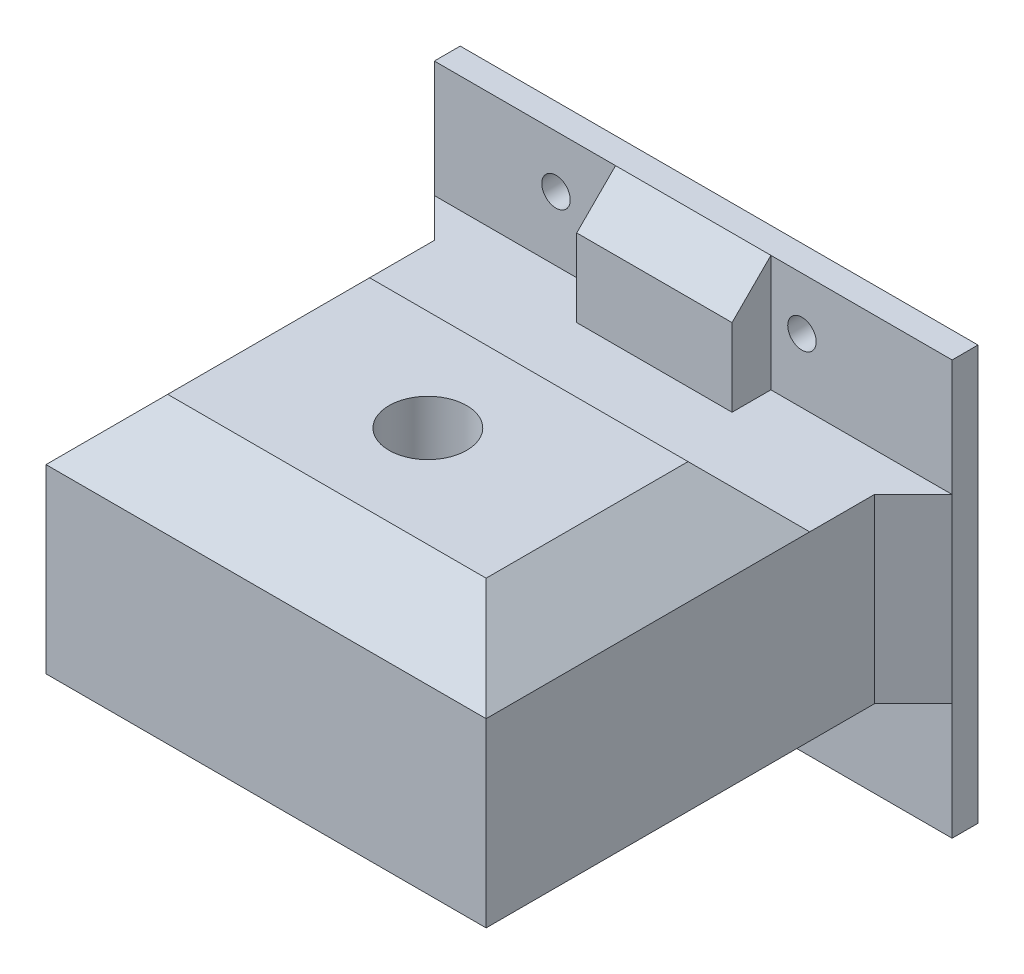
ISO-10303-21;
HEADER;
FILE_DESCRIPTION(('STEP AP214'),'2;1');
FILE_NAME('part.step','',(''),(''),'','','');
FILE_SCHEMA(('AUTOMOTIVE_DESIGN { 1 0 10303 214 1 1 1 1 }'));
ENDSEC;
DATA;
#1=APPLICATION_CONTEXT('core data for automotive mechanical design processes');
#2=APPLICATION_PROTOCOL_DEFINITION('international standard','automotive_design',2000,#1);
#3=PRODUCT_CONTEXT('',#1,'mechanical');
#4=PRODUCT('Part','Part','',(#3));
#5=PRODUCT_RELATED_PRODUCT_CATEGORY('part','',(#4));
#6=PRODUCT_DEFINITION_FORMATION('','',#4);
#7=PRODUCT_DEFINITION_CONTEXT('part definition',#1,'design');
#8=PRODUCT_DEFINITION('design','',#6,#7);
#9=PRODUCT_DEFINITION_SHAPE('','',#8);
#10=(LENGTH_UNIT() NAMED_UNIT(*) SI_UNIT(.MILLI.,.METRE.));
#11=(NAMED_UNIT(*) PLANE_ANGLE_UNIT() SI_UNIT($,.RADIAN.));
#12=(NAMED_UNIT(*) SI_UNIT($,.STERADIAN.) SOLID_ANGLE_UNIT());
#13=UNCERTAINTY_MEASURE_WITH_UNIT(LENGTH_MEASURE(1.E-05),#10,'distance_accuracy_value','');
#14=(GEOMETRIC_REPRESENTATION_CONTEXT(3) GLOBAL_UNCERTAINTY_ASSIGNED_CONTEXT((#13)) GLOBAL_UNIT_ASSIGNED_CONTEXT((#10,
#11,#12)) REPRESENTATION_CONTEXT('',''));
#15=CARTESIAN_POINT('',(0.,0.,0.));
#16=DIRECTION('',(0.,0.,1.));
#17=DIRECTION('',(1.,0.,0.));
#18=AXIS2_PLACEMENT_3D('',#15,#16,#17);
#19=CARTESIAN_POINT('',(612.,302.72,15.));
#20=DIRECTION('',(0.,-1.,0.));
#21=DIRECTION('',(0.,0.,-1.));
#22=AXIS2_PLACEMENT_3D('',#19,#20,#21);
#23=PLANE('',#22);
#24=DIRECTION('',(-1.,0.,0.));
#25=VECTOR('',#24,1.);
#26=CARTESIAN_POINT('',(497.,302.72,40.));
#27=LINE('',#26,#25);
#28=CARTESIAN_POINT('',(667.,302.72,40.));
#29=VERTEX_POINT('',#28);
#30=CARTESIAN_POINT('',(497.,302.72,40.));
#31=VERTEX_POINT('',#30);
#32=EDGE_CURVE('E249',#29,#31,#27,.T.);
#33=ORIENTED_EDGE('',*,*,#32,.F.);
#34=DIRECTION('',(0.,0.,-1.));
#35=VECTOR('',#34,1.);
#36=CARTESIAN_POINT('',(667.,302.72,165.));
#37=LINE('',#36,#35);
#38=CARTESIAN_POINT('',(667.,302.72,15.));
#39=VERTEX_POINT('',#38);
#40=EDGE_CURVE('E416',#29,#39,#37,.T.);
#41=ORIENTED_EDGE('',*,*,#40,.T.);
#42=DIRECTION('',(0.70710678118655,0.,-0.707106781186545));
#43=VECTOR('',#42,1.);
#44=CARTESIAN_POINT('',(667.,302.72,15.));
#45=LINE('',#44,#43);
#46=CARTESIAN_POINT('',(682.,302.72,0.));
#47=VERTEX_POINT('',#46);
#48=EDGE_CURVE('E297',#39,#47,#45,.T.);
#49=ORIENTED_EDGE('',*,*,#48,.T.);
#50=DIRECTION('',(-1.,0.,0.));
#51=VECTOR('',#50,1.);
#52=CARTESIAN_POINT('',(612.,302.72,0.));
#53=LINE('',#52,#51);
#54=CARTESIAN_POINT('',(612.,302.72,0.));
#55=VERTEX_POINT('',#54);
#56=EDGE_CURVE('E393',#47,#55,#53,.T.);
#57=ORIENTED_EDGE('',*,*,#56,.T.);
#58=DIRECTION('',(0.,0.,-1.));
#59=VECTOR('',#58,1.);
#60=CARTESIAN_POINT('',(612.,302.72,15.));
#61=LINE('',#60,#59);
#62=CARTESIAN_POINT('',(612.,302.72,15.));
#63=VERTEX_POINT('',#62);
#64=EDGE_CURVE('E376',#63,#55,#61,.T.);
#65=ORIENTED_EDGE('',*,*,#64,.F.);
#66=DIRECTION('',(-1.,0.,0.));
#67=VECTOR('',#66,1.);
#68=CARTESIAN_POINT('',(497.,302.72,15.));
#69=LINE('',#68,#67);
#70=CARTESIAN_POINT('',(552.,302.72,15.));
#71=VERTEX_POINT('',#70);
#72=EDGE_CURVE('E272',#63,#71,#69,.T.);
#73=ORIENTED_EDGE('',*,*,#72,.T.);
#74=DIRECTION('',(0.,0.,-1.));
#75=VECTOR('',#74,1.);
#76=CARTESIAN_POINT('',(552.,302.72,15.));
#77=LINE('',#76,#75);
#78=CARTESIAN_POINT('',(552.,302.72,0.));
#79=VERTEX_POINT('',#78);
#80=EDGE_CURVE('E379',#71,#79,#77,.T.);
#81=ORIENTED_EDGE('',*,*,#80,.T.);
#82=DIRECTION('',(-1.,0.,0.));
#83=VECTOR('',#82,1.);
#84=CARTESIAN_POINT('',(482.,302.72,0.));
#85=LINE('',#84,#83);
#86=CARTESIAN_POINT('',(482.,302.72,0.));
#87=VERTEX_POINT('',#86);
#88=EDGE_CURVE('E383',#79,#87,#85,.T.);
#89=ORIENTED_EDGE('',*,*,#88,.T.);
#90=DIRECTION('',(0.707106781186547,0.,0.707106781186548));
#91=VECTOR('',#90,1.);
#92=CARTESIAN_POINT('',(497.,302.72,15.));
#93=LINE('',#92,#91);
#94=CARTESIAN_POINT('',(497.,302.72,15.));
#95=VERTEX_POINT('',#94);
#96=EDGE_CURVE('E273',#87,#95,#93,.T.);
#97=ORIENTED_EDGE('',*,*,#96,.T.);
#98=DIRECTION('',(0.,0.,-1.));
#99=VECTOR('',#98,1.);
#100=CARTESIAN_POINT('',(497.,302.72,165.));
#101=LINE('',#100,#99);
#102=EDGE_CURVE('E418',#31,#95,#101,.T.);
#103=ORIENTED_EDGE('',*,*,#102,.F.);
#104=EDGE_LOOP('',(#33,#41,#49,#57,#65,#73,#81,#89,#97,#103));
#105=FACE_BOUND('',#104,.T.);
#106=ADVANCED_FACE('F38',(#105),#23,.F.);
#107=CARTESIAN_POINT('',(0.,0.,15.));
#108=DIRECTION('',(0.,0.,1.));
#109=DIRECTION('',(1.,0.,0.));
#110=AXIS2_PLACEMENT_3D('',#107,#108,#109);
#111=PLANE('',#110);
#112=ORIENTED_EDGE('',*,*,#72,.F.);
#113=DIRECTION('',(0.,1.,0.));
#114=VECTOR('',#113,1.);
#115=CARTESIAN_POINT('',(612.,347.72,15.));
#116=LINE('',#115,#114);
#117=CARTESIAN_POINT('',(612.,332.72,15.));
#118=VERTEX_POINT('',#117);
#119=EDGE_CURVE('E408',#63,#118,#116,.T.);
#120=ORIENTED_EDGE('',*,*,#119,.T.);
#121=DIRECTION('',(-1.,0.,0.));
#122=VECTOR('',#121,1.);
#123=CARTESIAN_POINT('',(552.,332.72,15.));
#124=LINE('',#123,#122);
#125=CARTESIAN_POINT('',(552.,332.72,15.));
#126=VERTEX_POINT('',#125);
#127=EDGE_CURVE('E302',#118,#126,#124,.T.);
#128=ORIENTED_EDGE('',*,*,#127,.T.);
#129=DIRECTION('',(0.,-1.,0.));
#130=VECTOR('',#129,1.);
#131=CARTESIAN_POINT('',(552.,347.72,15.));
#132=LINE('',#131,#130);
#133=EDGE_CURVE('E382',#126,#71,#132,.T.);
#134=ORIENTED_EDGE('',*,*,#133,.T.);
#135=EDGE_LOOP('',(#112,#120,#128,#134));
#136=FACE_BOUND('',#135,.T.);
#137=ADVANCED_FACE('F526',(#136),#111,.T.);
#138=CARTESIAN_POINT('',(0.,0.,0.));
#139=DIRECTION('',(0.,0.,-1.));
#140=DIRECTION('',(-1.,0.,0.));
#141=AXIS2_PLACEMENT_3D('',#138,#139,#140);
#142=PLANE('',#141);
#143=CARTESIAN_POINT('',(529.,327.5,0.));
#144=DIRECTION('',(0.,0.,-1.));
#145=DIRECTION('',(-1.,0.,0.));
#146=AXIS2_PLACEMENT_3D('',#143,#144,#145);
#147=CIRCLE('',#146,5.49999999999996);
#148=CARTESIAN_POINT('',(523.5,327.5,0.));
#149=VERTEX_POINT('',#148);
#150=EDGE_CURVE('E346',#149,#149,#147,.T.);
#151=ORIENTED_EDGE('',*,*,#150,.T.);
#152=EDGE_LOOP('',(#151));
#153=FACE_BOUND('',#152,.T.);
#154=ORIENTED_EDGE('',*,*,#88,.F.);
#155=DIRECTION('',(0.,-1.,0.));
#156=VECTOR('',#155,1.);
#157=CARTESIAN_POINT('',(552.,347.72,0.));
#158=LINE('',#157,#156);
#159=CARTESIAN_POINT('',(552.,347.72,0.));
#160=VERTEX_POINT('',#159);
#161=EDGE_CURVE('E387',#160,#79,#158,.T.);
#162=ORIENTED_EDGE('',*,*,#161,.F.);
#163=DIRECTION('',(1.,0.,0.));
#164=VECTOR('',#163,1.);
#165=CARTESIAN_POINT('',(482.,347.72,0.));
#166=LINE('',#165,#164);
#167=CARTESIAN_POINT('',(482.,347.72,0.));
#168=VERTEX_POINT('',#167);
#169=EDGE_CURVE('E335',#168,#160,#166,.T.);
#170=ORIENTED_EDGE('',*,*,#169,.F.);
#171=DIRECTION('',(0.,1.,0.));
#172=VECTOR('',#171,1.);
#173=CARTESIAN_POINT('',(482.,187.72,0.));
#174=LINE('',#173,#172);
#175=EDGE_CURVE('E326',#87,#168,#174,.T.);
#176=ORIENTED_EDGE('',*,*,#175,.F.);
#177=EDGE_LOOP('',(#154,#162,#170,#176));
#178=FACE_BOUND('',#177,.T.);
#179=ADVANCED_FACE('F531',(#153,#178),#142,.F.);
#180=CARTESIAN_POINT('',(624.,327.5,0.));
#181=DIRECTION('',(0.,0.,-1.));
#182=DIRECTION('',(-1.,0.,0.));
#183=AXIS2_PLACEMENT_3D('',#180,#181,#182);
#184=CIRCLE('',#183,5.49999999999996);
#185=CARTESIAN_POINT('',(618.5,327.5,0.));
#186=VERTEX_POINT('',#185);
#187=EDGE_CURVE('E365',#186,#186,#184,.T.);
#188=ORIENTED_EDGE('',*,*,#187,.T.);
#189=EDGE_LOOP('',(#188));
#190=FACE_BOUND('',#189,.T.);
#191=DIRECTION('',(0.,1.,0.));
#192=VECTOR('',#191,1.);
#193=CARTESIAN_POINT('',(612.,347.72,0.));
#194=LINE('',#193,#192);
#195=CARTESIAN_POINT('',(612.,347.72,0.));
#196=VERTEX_POINT('',#195);
#197=EDGE_CURVE('E390',#55,#196,#194,.T.);
#198=ORIENTED_EDGE('',*,*,#197,.F.);
#199=ORIENTED_EDGE('',*,*,#56,.F.);
#200=DIRECTION('',(0.,-1.,0.));
#201=VECTOR('',#200,1.);
#202=CARTESIAN_POINT('',(682.,347.72,0.));
#203=LINE('',#202,#201);
#204=CARTESIAN_POINT('',(682.,347.72,0.));
#205=VERTEX_POINT('',#204);
#206=EDGE_CURVE('E331',#205,#47,#203,.T.);
#207=ORIENTED_EDGE('',*,*,#206,.F.);
#208=EDGE_CURVE('E338',#196,#205,#166,.T.);
#209=ORIENTED_EDGE('',*,*,#208,.F.);
#210=EDGE_LOOP('',(#198,#199,#207,#209));
#211=FACE_BOUND('',#210,.T.);
#212=ADVANCED_FACE('F567',(#190,#211),#142,.F.);
#213=CARTESIAN_POINT('',(624.,216.5,0.));
#214=DIRECTION('',(0.,0.,-1.));
#215=DIRECTION('',(-1.,0.,0.));
#216=AXIS2_PLACEMENT_3D('',#213,#214,#215);
#217=CIRCLE('',#216,5.49999999999996);
#218=CARTESIAN_POINT('',(618.5,216.5,0.));
#219=VERTEX_POINT('',#218);
#220=EDGE_CURVE('E359',#219,#219,#217,.T.);
#221=ORIENTED_EDGE('',*,*,#220,.T.);
#222=EDGE_LOOP('',(#221));
#223=FACE_BOUND('',#222,.T.);
#224=DIRECTION('',(1.,0.,0.));
#225=VECTOR('',#224,1.);
#226=CARTESIAN_POINT('',(612.,232.72,0.));
#227=LINE('',#226,#225);
#228=CARTESIAN_POINT('',(612.,232.72,0.));
#229=VERTEX_POINT('',#228);
#230=CARTESIAN_POINT('',(682.,232.72,0.));
#231=VERTEX_POINT('',#230);
#232=EDGE_CURVE('E396',#229,#231,#227,.T.);
#233=ORIENTED_EDGE('',*,*,#232,.F.);
#234=DIRECTION('',(0.,1.,0.));
#235=VECTOR('',#234,1.);
#236=CARTESIAN_POINT('',(612.,232.72,0.));
#237=LINE('',#236,#235);
#238=CARTESIAN_POINT('',(612.,187.72,0.));
#239=VERTEX_POINT('',#238);
#240=EDGE_CURVE('E399',#239,#229,#237,.T.);
#241=ORIENTED_EDGE('',*,*,#240,.F.);
#242=DIRECTION('',(-1.,0.,0.));
#243=VECTOR('',#242,1.);
#244=CARTESIAN_POINT('',(682.,187.72,0.));
#245=LINE('',#244,#243);
#246=CARTESIAN_POINT('',(682.,187.72,0.));
#247=VERTEX_POINT('',#246);
#248=EDGE_CURVE('E327',#247,#239,#245,.T.);
#249=ORIENTED_EDGE('',*,*,#248,.F.);
#250=EDGE_CURVE('E334',#231,#247,#203,.T.);
#251=ORIENTED_EDGE('',*,*,#250,.F.);
#252=EDGE_LOOP('',(#233,#241,#249,#251));
#253=FACE_BOUND('',#252,.T.);
#254=ADVANCED_FACE('F833',(#223,#253),#142,.F.);
#255=CARTESIAN_POINT('',(529.,216.5,0.));
#256=DIRECTION('',(0.,0.,-1.));
#257=DIRECTION('',(-1.,0.,0.));
#258=AXIS2_PLACEMENT_3D('',#255,#256,#257);
#259=CIRCLE('',#258,5.49999999999996);
#260=CARTESIAN_POINT('',(523.5,216.5,0.));
#261=VERTEX_POINT('',#260);
#262=EDGE_CURVE('E353',#261,#261,#259,.T.);
#263=ORIENTED_EDGE('',*,*,#262,.T.);
#264=EDGE_LOOP('',(#263));
#265=FACE_BOUND('',#264,.T.);
#266=DIRECTION('',(0.,-1.,0.));
#267=VECTOR('',#266,1.);
#268=CARTESIAN_POINT('',(552.,232.72,0.));
#269=LINE('',#268,#267);
#270=CARTESIAN_POINT('',(552.,232.72,0.));
#271=VERTEX_POINT('',#270);
#272=CARTESIAN_POINT('',(552.,187.72,0.));
#273=VERTEX_POINT('',#272);
#274=EDGE_CURVE('E402',#271,#273,#269,.T.);
#275=ORIENTED_EDGE('',*,*,#274,.F.);
#276=DIRECTION('',(1.,0.,0.));
#277=VECTOR('',#276,1.);
#278=CARTESIAN_POINT('',(482.,232.72,0.));
#279=LINE('',#278,#277);
#280=CARTESIAN_POINT('',(482.,232.72,0.));
#281=VERTEX_POINT('',#280);
#282=EDGE_CURVE('E219',#281,#271,#279,.T.);
#283=ORIENTED_EDGE('',*,*,#282,.F.);
#284=CARTESIAN_POINT('',(482.,187.72,0.));
#285=VERTEX_POINT('',#284);
#286=EDGE_CURVE('E322',#285,#281,#174,.T.);
#287=ORIENTED_EDGE('',*,*,#286,.F.);
#288=EDGE_CURVE('E330',#273,#285,#245,.T.);
#289=ORIENTED_EDGE('',*,*,#288,.F.);
#290=EDGE_LOOP('',(#275,#283,#287,#289));
#291=FACE_BOUND('',#290,.T.);
#292=ADVANCED_FACE('F473',(#265,#291),#142,.F.);
#293=CARTESIAN_POINT('',(0.,0.,-10.));
#294=DIRECTION('',(0.,0.,-1.));
#295=DIRECTION('',(-1.,0.,0.));
#296=AXIS2_PLACEMENT_3D('',#293,#294,#295);
#297=PLANE('',#296);
#298=CARTESIAN_POINT('',(624.,216.5,-10.));
#299=DIRECTION('',(0.,0.,-1.));
#300=DIRECTION('',(-1.,0.,0.));
#301=AXIS2_PLACEMENT_3D('',#298,#299,#300);
#302=CIRCLE('',#301,5.49999999999996);
#303=CARTESIAN_POINT('',(618.5,216.5,-10.));
#304=VERTEX_POINT('',#303);
#305=EDGE_CURVE('E356',#304,#304,#302,.T.);
#306=ORIENTED_EDGE('',*,*,#305,.F.);
#307=EDGE_LOOP('',(#306));
#308=FACE_BOUND('',#307,.T.);
#309=CARTESIAN_POINT('',(529.,327.5,-10.));
#310=DIRECTION('',(0.,0.,-1.));
#311=DIRECTION('',(-1.,0.,0.));
#312=AXIS2_PLACEMENT_3D('',#309,#310,#311);
#313=CIRCLE('',#312,5.49999999999996);
#314=CARTESIAN_POINT('',(523.5,327.5,-10.));
#315=VERTEX_POINT('',#314);
#316=EDGE_CURVE('E349',#315,#315,#313,.T.);
#317=ORIENTED_EDGE('',*,*,#316,.F.);
#318=EDGE_LOOP('',(#317));
#319=FACE_BOUND('',#318,.T.);
#320=DIRECTION('',(1.,0.,0.));
#321=VECTOR('',#320,1.);
#322=CARTESIAN_POINT('',(482.,347.72,-10.));
#323=LINE('',#322,#321);
#324=CARTESIAN_POINT('',(482.,347.72,-10.));
#325=VERTEX_POINT('',#324);
#326=CARTESIAN_POINT('',(682.,347.72,-10.));
#327=VERTEX_POINT('',#326);
#328=EDGE_CURVE('E325',#325,#327,#323,.T.);
#329=ORIENTED_EDGE('',*,*,#328,.T.);
#330=DIRECTION('',(0.,-1.,0.));
#331=VECTOR('',#330,1.);
#332=CARTESIAN_POINT('',(682.,347.72,-10.));
#333=LINE('',#332,#331);
#334=CARTESIAN_POINT('',(682.,187.72,-10.));
#335=VERTEX_POINT('',#334);
#336=EDGE_CURVE('E342',#327,#335,#333,.T.);
#337=ORIENTED_EDGE('',*,*,#336,.T.);
#338=DIRECTION('',(-1.,0.,0.));
#339=VECTOR('',#338,1.);
#340=CARTESIAN_POINT('',(682.,187.72,-10.));
#341=LINE('',#340,#339);
#342=CARTESIAN_POINT('',(482.,187.72,-10.));
#343=VERTEX_POINT('',#342);
#344=EDGE_CURVE('E340',#335,#343,#341,.T.);
#345=ORIENTED_EDGE('',*,*,#344,.T.);
#346=DIRECTION('',(0.,1.,0.));
#347=VECTOR('',#346,1.);
#348=CARTESIAN_POINT('',(482.,187.72,-10.));
#349=LINE('',#348,#347);
#350=EDGE_CURVE('E321',#343,#325,#349,.T.);
#351=ORIENTED_EDGE('',*,*,#350,.T.);
#352=EDGE_LOOP('',(#329,#337,#345,#351));
#353=FACE_BOUND('',#352,.T.);
#354=CARTESIAN_POINT('',(529.,216.5,-10.));
#355=DIRECTION('',(0.,0.,-1.));
#356=DIRECTION('',(-1.,0.,0.));
#357=AXIS2_PLACEMENT_3D('',#354,#355,#356);
#358=CIRCLE('',#357,5.49999999999996);
#359=CARTESIAN_POINT('',(523.5,216.5,-10.));
#360=VERTEX_POINT('',#359);
#361=EDGE_CURVE('E350',#360,#360,#358,.T.);
#362=ORIENTED_EDGE('',*,*,#361,.F.);
#363=EDGE_LOOP('',(#362));
#364=FACE_BOUND('',#363,.T.);
#365=CARTESIAN_POINT('',(624.,327.5,-10.));
#366=DIRECTION('',(0.,0.,-1.));
#367=DIRECTION('',(-1.,0.,0.));
#368=AXIS2_PLACEMENT_3D('',#365,#366,#367);
#369=CIRCLE('',#368,5.49999999999996);
#370=CARTESIAN_POINT('',(618.5,327.5,-10.));
#371=VERTEX_POINT('',#370);
#372=EDGE_CURVE('E362',#371,#371,#369,.T.);
#373=ORIENTED_EDGE('',*,*,#372,.F.);
#374=EDGE_LOOP('',(#373));
#375=FACE_BOUND('',#374,.T.);
#376=ADVANCED_FACE('F560',(#308,#319,#353,#364,#375),#297,.T.);
#377=CARTESIAN_POINT('',(482.,347.72,-10.));
#378=DIRECTION('',(0.,-1.,0.));
#379=DIRECTION('',(0.,0.,-1.));
#380=AXIS2_PLACEMENT_3D('',#377,#378,#379);
#381=PLANE('',#380);
#382=ORIENTED_EDGE('',*,*,#169,.T.);
#383=DIRECTION('',(1.,0.,0.));
#384=VECTOR('',#383,1.);
#385=CARTESIAN_POINT('',(612.,347.72,0.));
#386=LINE('',#385,#384);
#387=EDGE_CURVE('E289',#160,#196,#386,.T.);
#388=ORIENTED_EDGE('',*,*,#387,.T.);
#389=ORIENTED_EDGE('',*,*,#208,.T.);
#390=DIRECTION('',(0.,0.,1.));
#391=VECTOR('',#390,1.);
#392=CARTESIAN_POINT('',(682.,347.72,-10.));
#393=LINE('',#392,#391);
#394=EDGE_CURVE('E309',#327,#205,#393,.T.);
#395=ORIENTED_EDGE('',*,*,#394,.F.);
#396=ORIENTED_EDGE('',*,*,#328,.F.);
#397=DIRECTION('',(0.,0.,1.));
#398=VECTOR('',#397,1.);
#399=CARTESIAN_POINT('',(482.,347.72,-10.));
#400=LINE('',#399,#398);
#401=EDGE_CURVE('E318',#325,#168,#400,.T.);
#402=ORIENTED_EDGE('',*,*,#401,.T.);
#403=EDGE_LOOP('',(#382,#388,#389,#395,#396,#402));
#404=FACE_BOUND('',#403,.T.);
#405=ADVANCED_FACE('F563',(#404),#381,.F.);
#406=CARTESIAN_POINT('',(682.,347.72,-10.));
#407=DIRECTION('',(-1.,0.,0.));
#408=DIRECTION('',(0.,0.,1.));
#409=AXIS2_PLACEMENT_3D('',#406,#407,#408);
#410=PLANE('',#409);
#411=ORIENTED_EDGE('',*,*,#206,.T.);
#412=DIRECTION('',(0.,-1.,0.));
#413=VECTOR('',#412,1.);
#414=CARTESIAN_POINT('',(682.,232.72,0.));
#415=LINE('',#414,#413);
#416=EDGE_CURVE('E295',#47,#231,#415,.T.);
#417=ORIENTED_EDGE('',*,*,#416,.T.);
#418=ORIENTED_EDGE('',*,*,#250,.T.);
#419=DIRECTION('',(0.,0.,1.));
#420=VECTOR('',#419,1.);
#421=CARTESIAN_POINT('',(682.,187.72,-10.));
#422=LINE('',#421,#420);
#423=EDGE_CURVE('E312',#335,#247,#422,.T.);
#424=ORIENTED_EDGE('',*,*,#423,.F.);
#425=ORIENTED_EDGE('',*,*,#336,.F.);
#426=ORIENTED_EDGE('',*,*,#394,.T.);
#427=EDGE_LOOP('',(#411,#417,#418,#424,#425,#426));
#428=FACE_BOUND('',#427,.T.);
#429=ADVANCED_FACE('F573',(#428),#410,.F.);
#430=CARTESIAN_POINT('',(682.,187.72,-10.));
#431=DIRECTION('',(0.,1.,0.));
#432=DIRECTION('',(0.,0.,1.));
#433=AXIS2_PLACEMENT_3D('',#430,#431,#432);
#434=PLANE('',#433);
#435=ORIENTED_EDGE('',*,*,#248,.T.);
#436=DIRECTION('',(-1.,0.,0.));
#437=VECTOR('',#436,1.);
#438=CARTESIAN_POINT('',(552.,187.72,0.));
#439=LINE('',#438,#437);
#440=EDGE_CURVE('E283',#239,#273,#439,.T.);
#441=ORIENTED_EDGE('',*,*,#440,.T.);
#442=ORIENTED_EDGE('',*,*,#288,.T.);
#443=DIRECTION('',(0.,0.,1.));
#444=VECTOR('',#443,1.);
#445=CARTESIAN_POINT('',(482.,187.72,-10.));
#446=LINE('',#445,#444);
#447=EDGE_CURVE('E315',#343,#285,#446,.T.);
#448=ORIENTED_EDGE('',*,*,#447,.F.);
#449=ORIENTED_EDGE('',*,*,#344,.F.);
#450=ORIENTED_EDGE('',*,*,#423,.T.);
#451=EDGE_LOOP('',(#435,#441,#442,#448,#449,#450));
#452=FACE_BOUND('',#451,.T.);
#453=ADVANCED_FACE('F483',(#452),#434,.F.);
#454=CARTESIAN_POINT('',(482.,187.72,-10.));
#455=DIRECTION('',(1.,0.,0.));
#456=DIRECTION('',(0.,0.,-1.));
#457=AXIS2_PLACEMENT_3D('',#454,#455,#456);
#458=PLANE('',#457);
#459=ORIENTED_EDGE('',*,*,#286,.T.);
#460=DIRECTION('',(0.,1.,0.));
#461=VECTOR('',#460,1.);
#462=CARTESIAN_POINT('',(482.,302.72,0.));
#463=LINE('',#462,#461);
#464=EDGE_CURVE('E277',#281,#87,#463,.T.);
#465=ORIENTED_EDGE('',*,*,#464,.T.);
#466=ORIENTED_EDGE('',*,*,#175,.T.);
#467=ORIENTED_EDGE('',*,*,#401,.F.);
#468=ORIENTED_EDGE('',*,*,#350,.F.);
#469=ORIENTED_EDGE('',*,*,#447,.T.);
#470=EDGE_LOOP('',(#459,#465,#466,#467,#468,#469));
#471=FACE_BOUND('',#470,.T.);
#472=ADVANCED_FACE('F476',(#471),#458,.F.);
#473=CARTESIAN_POINT('',(529.,327.5,-10.));
#474=DIRECTION('',(0.,0.,1.));
#475=DIRECTION('',(1.,0.,0.));
#476=AXIS2_PLACEMENT_3D('',#473,#474,#475);
#477=CYLINDRICAL_SURFACE('',#476,5.49999999999996);
#478=ORIENTED_EDGE('',*,*,#316,.T.);
#479=EDGE_LOOP('',(#478));
#480=FACE_BOUND('',#479,.T.);
#481=ORIENTED_EDGE('',*,*,#150,.F.);
#482=EDGE_LOOP('',(#481));
#483=FACE_BOUND('',#482,.T.);
#484=ADVANCED_FACE('F555',(#480,#483),#477,.F.);
#485=CARTESIAN_POINT('',(529.,216.5,-10.));
#486=DIRECTION('',(0.,0.,1.));
#487=DIRECTION('',(1.,0.,0.));
#488=AXIS2_PLACEMENT_3D('',#485,#486,#487);
#489=CYLINDRICAL_SURFACE('',#488,5.49999999999996);
#490=ORIENTED_EDGE('',*,*,#361,.T.);
#491=EDGE_LOOP('',(#490));
#492=FACE_BOUND('',#491,.T.);
#493=ORIENTED_EDGE('',*,*,#262,.F.);
#494=EDGE_LOOP('',(#493));
#495=FACE_BOUND('',#494,.T.);
#496=ADVANCED_FACE('F551',(#492,#495),#489,.F.);
#497=CARTESIAN_POINT('',(624.,216.5,-10.));
#498=DIRECTION('',(0.,0.,1.));
#499=DIRECTION('',(1.,0.,0.));
#500=AXIS2_PLACEMENT_3D('',#497,#498,#499);
#501=CYLINDRICAL_SURFACE('',#500,5.49999999999996);
#502=ORIENTED_EDGE('',*,*,#305,.T.);
#503=EDGE_LOOP('',(#502));
#504=FACE_BOUND('',#503,.T.);
#505=ORIENTED_EDGE('',*,*,#220,.F.);
#506=EDGE_LOOP('',(#505));
#507=FACE_BOUND('',#506,.T.);
#508=ADVANCED_FACE('F547',(#504,#507),#501,.F.);
#509=CARTESIAN_POINT('',(624.,327.5,-10.));
#510=DIRECTION('',(0.,0.,1.));
#511=DIRECTION('',(1.,0.,0.));
#512=AXIS2_PLACEMENT_3D('',#509,#510,#511);
#513=CYLINDRICAL_SURFACE('',#512,5.49999999999996);
#514=ORIENTED_EDGE('',*,*,#372,.T.);
#515=EDGE_LOOP('',(#514));
#516=FACE_BOUND('',#515,.T.);
#517=ORIENTED_EDGE('',*,*,#187,.F.);
#518=EDGE_LOOP('',(#517));
#519=FACE_BOUND('',#518,.T.);
#520=ADVANCED_FACE('F544',(#516,#519),#513,.F.);
#521=CARTESIAN_POINT('',(482.,232.72,15.));
#522=DIRECTION('',(0.,1.,0.));
#523=DIRECTION('',(0.,0.,1.));
#524=AXIS2_PLACEMENT_3D('',#521,#522,#523);
#525=PLANE('',#524);
#526=DIRECTION('',(0.,0.,-1.));
#527=VECTOR('',#526,1.);
#528=CARTESIAN_POINT('',(667.,232.72,165.));
#529=LINE('',#528,#527);
#530=CARTESIAN_POINT('',(667.,232.72,40.));
#531=VERTEX_POINT('',#530);
#532=CARTESIAN_POINT('',(667.,232.72,15.));
#533=VERTEX_POINT('',#532);
#534=EDGE_CURVE('E208',#531,#533,#529,.T.);
#535=ORIENTED_EDGE('',*,*,#534,.F.);
#536=DIRECTION('',(-1.,0.,0.));
#537=VECTOR('',#536,1.);
#538=CARTESIAN_POINT('',(497.,232.72,40.));
#539=LINE('',#538,#537);
#540=CARTESIAN_POINT('',(497.,232.72,40.));
#541=VERTEX_POINT('',#540);
#542=EDGE_CURVE('E203',#531,#541,#539,.T.);
#543=ORIENTED_EDGE('',*,*,#542,.T.);
#544=DIRECTION('',(0.,0.,-1.));
#545=VECTOR('',#544,1.);
#546=CARTESIAN_POINT('',(497.,232.72,165.));
#547=LINE('',#546,#545);
#548=CARTESIAN_POINT('',(497.,232.72,15.));
#549=VERTEX_POINT('',#548);
#550=EDGE_CURVE('E205',#541,#549,#547,.T.);
#551=ORIENTED_EDGE('',*,*,#550,.T.);
#552=DIRECTION('',(-0.707106781186547,0.,-0.707106781186548));
#553=VECTOR('',#552,1.);
#554=CARTESIAN_POINT('',(497.,232.72,15.));
#555=LINE('',#554,#553);
#556=EDGE_CURVE('E279',#549,#281,#555,.T.);
#557=ORIENTED_EDGE('',*,*,#556,.T.);
#558=ORIENTED_EDGE('',*,*,#282,.T.);
#559=DIRECTION('',(0.,0.,-1.));
#560=VECTOR('',#559,1.);
#561=CARTESIAN_POINT('',(552.,232.72,15.));
#562=LINE('',#561,#560);
#563=CARTESIAN_POINT('',(552.,232.72,15.));
#564=VERTEX_POINT('',#563);
#565=EDGE_CURVE('E368',#564,#271,#562,.T.);
#566=ORIENTED_EDGE('',*,*,#565,.F.);
#567=DIRECTION('',(1.,0.,0.));
#568=VECTOR('',#567,1.);
#569=CARTESIAN_POINT('',(497.,232.72,15.));
#570=LINE('',#569,#568);
#571=CARTESIAN_POINT('',(612.,232.72,15.));
#572=VERTEX_POINT('',#571);
#573=EDGE_CURVE('E276',#564,#572,#570,.T.);
#574=ORIENTED_EDGE('',*,*,#573,.T.);
#575=DIRECTION('',(0.,0.,-1.));
#576=VECTOR('',#575,1.);
#577=CARTESIAN_POINT('',(612.,232.72,15.));
#578=LINE('',#577,#576);
#579=EDGE_CURVE('E373',#572,#229,#578,.T.);
#580=ORIENTED_EDGE('',*,*,#579,.T.);
#581=ORIENTED_EDGE('',*,*,#232,.T.);
#582=DIRECTION('',(-0.70710678118655,0.,0.707106781186545));
#583=VECTOR('',#582,1.);
#584=CARTESIAN_POINT('',(667.,232.72,15.));
#585=LINE('',#584,#583);
#586=EDGE_CURVE('E293',#231,#533,#585,.T.);
#587=ORIENTED_EDGE('',*,*,#586,.T.);
#588=EDGE_LOOP('',(#535,#543,#551,#557,#558,#566,#574,#580,#581,#587));
#589=FACE_BOUND('',#588,.T.);
#590=ADVANCED_FACE('F204',(#589),#525,.F.);
#591=CARTESIAN_POINT('',(552.,232.72,15.));
#592=DIRECTION('',(1.,0.,0.));
#593=DIRECTION('',(0.,0.,-1.));
#594=AXIS2_PLACEMENT_3D('',#591,#592,#593);
#595=PLANE('',#594);
#596=ORIENTED_EDGE('',*,*,#274,.T.);
#597=DIRECTION('',(0.,0.707106781186546,0.707106781186549));
#598=VECTOR('',#597,1.);
#599=CARTESIAN_POINT('',(552.,202.72,15.));
#600=LINE('',#599,#598);
#601=CARTESIAN_POINT('',(552.,202.72,15.));
#602=VERTEX_POINT('',#601);
#603=EDGE_CURVE('E281',#273,#602,#600,.T.);
#604=ORIENTED_EDGE('',*,*,#603,.T.);
#605=DIRECTION('',(0.,-1.,0.));
#606=VECTOR('',#605,1.);
#607=CARTESIAN_POINT('',(552.,232.72,15.));
#608=LINE('',#607,#606);
#609=EDGE_CURVE('E386',#564,#602,#608,.T.);
#610=ORIENTED_EDGE('',*,*,#609,.F.);
#611=ORIENTED_EDGE('',*,*,#565,.T.);
#612=EDGE_LOOP('',(#596,#604,#610,#611));
#613=FACE_BOUND('',#612,.T.);
#614=ADVANCED_FACE('F487',(#613),#595,.F.);
#615=CARTESIAN_POINT('',(612.,232.72,15.));
#616=DIRECTION('',(-1.,0.,0.));
#617=DIRECTION('',(0.,0.,1.));
#618=AXIS2_PLACEMENT_3D('',#615,#616,#617);
#619=PLANE('',#618);
#620=DIRECTION('',(0.,1.,0.));
#621=VECTOR('',#620,1.);
#622=CARTESIAN_POINT('',(612.,232.72,15.));
#623=LINE('',#622,#621);
#624=CARTESIAN_POINT('',(612.,202.72,15.));
#625=VERTEX_POINT('',#624);
#626=EDGE_CURVE('E411',#625,#572,#623,.T.);
#627=ORIENTED_EDGE('',*,*,#626,.F.);
#628=DIRECTION('',(0.,-0.707106781186546,-0.707106781186549));
#629=VECTOR('',#628,1.);
#630=CARTESIAN_POINT('',(612.,202.72,15.));
#631=LINE('',#630,#629);
#632=EDGE_CURVE('E285',#625,#239,#631,.T.);
#633=ORIENTED_EDGE('',*,*,#632,.T.);
#634=ORIENTED_EDGE('',*,*,#240,.T.);
#635=ORIENTED_EDGE('',*,*,#579,.F.);
#636=EDGE_LOOP('',(#627,#633,#634,#635));
#637=FACE_BOUND('',#636,.T.);
#638=ADVANCED_FACE('F497',(#637),#619,.F.);
#639=CARTESIAN_POINT('',(612.,347.72,15.));
#640=DIRECTION('',(-1.,0.,0.));
#641=DIRECTION('',(0.,0.,1.));
#642=AXIS2_PLACEMENT_3D('',#639,#640,#641);
#643=PLANE('',#642);
#644=ORIENTED_EDGE('',*,*,#197,.T.);
#645=DIRECTION('',(0.,-0.707106781186547,0.707106781186548));
#646=VECTOR('',#645,1.);
#647=CARTESIAN_POINT('',(612.,332.72,15.));
#648=LINE('',#647,#646);
#649=EDGE_CURVE('E287',#196,#118,#648,.T.);
#650=ORIENTED_EDGE('',*,*,#649,.T.);
#651=ORIENTED_EDGE('',*,*,#119,.F.);
#652=ORIENTED_EDGE('',*,*,#64,.T.);
#653=EDGE_LOOP('',(#644,#650,#651,#652));
#654=FACE_BOUND('',#653,.T.);
#655=ADVANCED_FACE('F536',(#654),#643,.F.);
#656=CARTESIAN_POINT('',(552.,347.72,15.));
#657=DIRECTION('',(1.,0.,0.));
#658=DIRECTION('',(0.,0.,-1.));
#659=AXIS2_PLACEMENT_3D('',#656,#657,#658);
#660=PLANE('',#659);
#661=ORIENTED_EDGE('',*,*,#133,.F.);
#662=DIRECTION('',(0.,0.707106781186547,-0.707106781186548));
#663=VECTOR('',#662,1.);
#664=CARTESIAN_POINT('',(552.,332.72,15.));
#665=LINE('',#664,#663);
#666=EDGE_CURVE('E291',#126,#160,#665,.T.);
#667=ORIENTED_EDGE('',*,*,#666,.T.);
#668=ORIENTED_EDGE('',*,*,#161,.T.);
#669=ORIENTED_EDGE('',*,*,#80,.F.);
#670=EDGE_LOOP('',(#661,#667,#668,#669));
#671=FACE_BOUND('',#670,.T.);
#672=ADVANCED_FACE('F752',(#671),#660,.F.);
#673=ORIENTED_EDGE('',*,*,#573,.F.);
#674=ORIENTED_EDGE('',*,*,#609,.T.);
#675=DIRECTION('',(1.,0.,0.));
#676=VECTOR('',#675,1.);
#677=CARTESIAN_POINT('',(612.,202.72,15.));
#678=LINE('',#677,#676);
#679=EDGE_CURVE('E305',#602,#625,#678,.T.);
#680=ORIENTED_EDGE('',*,*,#679,.T.);
#681=ORIENTED_EDGE('',*,*,#626,.T.);
#682=EDGE_LOOP('',(#673,#674,#680,#681));
#683=FACE_BOUND('',#682,.T.);
#684=ADVANCED_FACE('F494',(#683),#111,.T.);
#685=CARTESIAN_POINT('',(667.,0.,15.));
#686=DIRECTION('',(0.707106781186545,0.,0.70710678118655));
#687=DIRECTION('',(0.,-1.,0.));
#688=AXIS2_PLACEMENT_3D('',#685,#686,#687);
#689=PLANE('',#688);
#690=ORIENTED_EDGE('',*,*,#586,.F.);
#691=ORIENTED_EDGE('',*,*,#416,.F.);
#692=ORIENTED_EDGE('',*,*,#48,.F.);
#693=DIRECTION('',(0.,1.,0.));
#694=VECTOR('',#693,1.);
#695=CARTESIAN_POINT('',(667.,302.72,15.));
#696=LINE('',#695,#694);
#697=EDGE_CURVE('E299',#533,#39,#696,.T.);
#698=ORIENTED_EDGE('',*,*,#697,.F.);
#699=EDGE_LOOP('',(#690,#691,#692,#698));
#700=FACE_BOUND('',#699,.T.);
#701=ADVANCED_FACE('F505',(#700),#689,.T.);
#702=CARTESIAN_POINT('',(0.,332.72,15.));
#703=DIRECTION('',(0.,0.707106781186548,0.707106781186547));
#704=DIRECTION('',(1.,0.,0.));
#705=AXIS2_PLACEMENT_3D('',#702,#703,#704);
#706=PLANE('',#705);
#707=ORIENTED_EDGE('',*,*,#649,.F.);
#708=ORIENTED_EDGE('',*,*,#387,.F.);
#709=ORIENTED_EDGE('',*,*,#666,.F.);
#710=ORIENTED_EDGE('',*,*,#127,.F.);
#711=EDGE_LOOP('',(#707,#708,#709,#710));
#712=FACE_BOUND('',#711,.T.);
#713=ADVANCED_FACE('F586',(#712),#706,.T.);
#714=CARTESIAN_POINT('',(0.,202.72,15.));
#715=DIRECTION('',(0.,-0.707106781186549,0.707106781186546));
#716=DIRECTION('',(-1.,0.,0.));
#717=AXIS2_PLACEMENT_3D('',#714,#715,#716);
#718=PLANE('',#717);
#719=ORIENTED_EDGE('',*,*,#603,.F.);
#720=ORIENTED_EDGE('',*,*,#440,.F.);
#721=ORIENTED_EDGE('',*,*,#632,.F.);
#722=ORIENTED_EDGE('',*,*,#679,.F.);
#723=EDGE_LOOP('',(#719,#720,#721,#722));
#724=FACE_BOUND('',#723,.T.);
#725=ADVANCED_FACE('F491',(#724),#718,.T.);
#726=CARTESIAN_POINT('',(497.,0.,15.));
#727=DIRECTION('',(-0.707106781186548,0.,0.707106781186547));
#728=DIRECTION('',(0.,1.,0.));
#729=AXIS2_PLACEMENT_3D('',#726,#727,#728);
#730=PLANE('',#729);
#731=ORIENTED_EDGE('',*,*,#96,.F.);
#732=ORIENTED_EDGE('',*,*,#464,.F.);
#733=ORIENTED_EDGE('',*,*,#556,.F.);
#734=DIRECTION('',(0.,-1.,0.));
#735=VECTOR('',#734,1.);
#736=CARTESIAN_POINT('',(497.,232.72,15.));
#737=LINE('',#736,#735);
#738=EDGE_CURVE('E218',#95,#549,#737,.T.);
#739=ORIENTED_EDGE('',*,*,#738,.F.);
#740=EDGE_LOOP('',(#731,#732,#733,#739));
#741=FACE_BOUND('',#740,.T.);
#742=ADVANCED_FACE('F468',(#741),#730,.T.);
#743=CARTESIAN_POINT('',(497.,302.72,165.));
#744=DIRECTION('',(1.,0.,0.));
#745=DIRECTION('',(0.,0.,-1.));
#746=AXIS2_PLACEMENT_3D('',#743,#744,#745);
#747=PLANE('',#746);
#748=ORIENTED_EDGE('',*,*,#550,.F.);
#749=DIRECTION('',(0.,0.,1.));
#750=VECTOR('',#749,1.);
#751=CARTESIAN_POINT('',(497.,232.72,165.));
#752=LINE('',#751,#750);
#753=CARTESIAN_POINT('',(497.,232.72,165.));
#754=VERTEX_POINT('',#753);
#755=EDGE_CURVE('E11',#541,#754,#752,.T.);
#756=ORIENTED_EDGE('',*,*,#755,.T.);
#757=DIRECTION('',(0.,-1.,0.));
#758=VECTOR('',#757,1.);
#759=CARTESIAN_POINT('',(497.,302.72,165.));
#760=LINE('',#759,#758);
#761=CARTESIAN_POINT('',(497.,302.72,165.));
#762=VERTEX_POINT('',#761);
#763=EDGE_CURVE('E426',#762,#754,#760,.T.);
#764=ORIENTED_EDGE('',*,*,#763,.F.);
#765=DIRECTION('',(0.,0.,-1.));
#766=VECTOR('',#765,1.);
#767=CARTESIAN_POINT('',(497.,302.72,165.));
#768=LINE('',#767,#766);
#769=EDGE_CURVE('E245',#762,#31,#768,.T.);
#770=ORIENTED_EDGE('',*,*,#769,.T.);
#771=ORIENTED_EDGE('',*,*,#102,.T.);
#772=ORIENTED_EDGE('',*,*,#738,.T.);
#773=EDGE_LOOP('',(#748,#756,#764,#770,#771,#772));
#774=FACE_BOUND('',#773,.T.);
#775=ADVANCED_FACE('F216',(#774),#747,.F.);
#776=CARTESIAN_POINT('',(667.,302.72,165.));
#777=DIRECTION('',(-1.,0.,0.));
#778=DIRECTION('',(0.,0.,1.));
#779=AXIS2_PLACEMENT_3D('',#776,#777,#778);
#780=PLANE('',#779);
#781=DIRECTION('',(0.,1.,0.));
#782=VECTOR('',#781,1.);
#783=CARTESIAN_POINT('',(667.,302.72,165.));
#784=LINE('',#783,#782);
#785=CARTESIAN_POINT('',(667.,232.72,165.));
#786=VERTEX_POINT('',#785);
#787=CARTESIAN_POINT('',(667.,302.72,165.));
#788=VERTEX_POINT('',#787);
#789=EDGE_CURVE('E420',#786,#788,#784,.T.);
#790=ORIENTED_EDGE('',*,*,#789,.F.);
#791=DIRECTION('',(0.,0.,-1.));
#792=VECTOR('',#791,1.);
#793=CARTESIAN_POINT('',(667.,232.72,165.));
#794=LINE('',#793,#792);
#795=EDGE_CURVE('E243',#786,#531,#794,.T.);
#796=ORIENTED_EDGE('',*,*,#795,.T.);
#797=ORIENTED_EDGE('',*,*,#534,.T.);
#798=ORIENTED_EDGE('',*,*,#697,.T.);
#799=ORIENTED_EDGE('',*,*,#40,.F.);
#800=DIRECTION('',(0.,0.,1.));
#801=VECTOR('',#800,1.);
#802=CARTESIAN_POINT('',(667.,302.72,165.));
#803=LINE('',#802,#801);
#804=EDGE_CURVE('E260',#29,#788,#803,.T.);
#805=ORIENTED_EDGE('',*,*,#804,.T.);
#806=EDGE_LOOP('',(#790,#796,#797,#798,#799,#805));
#807=FACE_BOUND('',#806,.T.);
#808=ADVANCED_FACE('F509',(#807),#780,.F.);
#809=CARTESIAN_POINT('',(0.,0.,165.));
#810=DIRECTION('',(0.,0.,1.));
#811=DIRECTION('',(1.,0.,0.));
#812=AXIS2_PLACEMENT_3D('',#809,#810,#811);
#813=PLANE('',#812);
#814=ORIENTED_EDGE('',*,*,#763,.T.);
#815=DIRECTION('',(1.,0.,0.));
#816=VECTOR('',#815,1.);
#817=CARTESIAN_POINT('',(667.,232.72,165.));
#818=LINE('',#817,#816);
#819=EDGE_CURVE('E48',#754,#786,#818,.T.);
#820=ORIENTED_EDGE('',*,*,#819,.T.);
#821=ORIENTED_EDGE('',*,*,#789,.T.);
#822=DIRECTION('',(-1.,0.,0.));
#823=VECTOR('',#822,1.);
#824=CARTESIAN_POINT('',(497.,302.72,165.));
#825=LINE('',#824,#823);
#826=EDGE_CURVE('E258',#788,#762,#825,.T.);
#827=ORIENTED_EDGE('',*,*,#826,.T.);
#828=EDGE_LOOP('',(#814,#820,#821,#827));
#829=FACE_BOUND('',#828,.T.);
#830=ADVANCED_FACE('F442',(#829),#813,.T.);
#831=CARTESIAN_POINT('',(0.,326.22,0.));
#832=DIRECTION('',(0.,-1.,0.));
#833=DIRECTION('',(0.,0.,-1.));
#834=AXIS2_PLACEMENT_3D('',#831,#832,#833);
#835=PLANE('',#834);
#836=CARTESIAN_POINT('',(582.,326.22,102.5));
#837=DIRECTION('',(0.,1.,0.));
#838=DIRECTION('',(0.,0.,1.));
#839=AXIS2_PLACEMENT_3D('',#836,#837,#838);
#840=CIRCLE('',#839,15.);
#841=CARTESIAN_POINT('',(582.,326.22,117.5));
#842=VERTEX_POINT('',#841);
#843=EDGE_CURVE('E432',#842,#842,#840,.T.);
#844=ORIENTED_EDGE('',*,*,#843,.F.);
#845=EDGE_LOOP('',(#844));
#846=FACE_BOUND('',#845,.T.);
#847=DIRECTION('',(1.,0.,0.));
#848=VECTOR('',#847,1.);
#849=CARTESIAN_POINT('',(667.,326.22,141.5));
#850=LINE('',#849,#848);
#851=CARTESIAN_POINT('',(520.5,326.22,141.5));
#852=VERTEX_POINT('',#851);
#853=CARTESIAN_POINT('',(643.5,326.22,141.5));
#854=VERTEX_POINT('',#853);
#855=EDGE_CURVE('E268',#852,#854,#850,.T.);
#856=ORIENTED_EDGE('',*,*,#855,.T.);
#857=DIRECTION('',(0.,0.,-1.));
#858=VECTOR('',#857,1.);
#859=CARTESIAN_POINT('',(643.5,326.22,0.));
#860=LINE('',#859,#858);
#861=CARTESIAN_POINT('',(643.5,326.22,63.5000000000001));
#862=VERTEX_POINT('',#861);
#863=EDGE_CURVE('E263',#854,#862,#860,.T.);
#864=ORIENTED_EDGE('',*,*,#863,.T.);
#865=DIRECTION('',(-1.,0.,0.));
#866=VECTOR('',#865,1.);
#867=CARTESIAN_POINT('',(0.,326.22,63.5));
#868=LINE('',#867,#866);
#869=CARTESIAN_POINT('',(520.5,326.22,63.5000000000001));
#870=VERTEX_POINT('',#869);
#871=EDGE_CURVE('E266',#862,#870,#868,.T.);
#872=ORIENTED_EDGE('',*,*,#871,.T.);
#873=DIRECTION('',(0.,0.,1.));
#874=VECTOR('',#873,1.);
#875=CARTESIAN_POINT('',(520.5,326.22,0.));
#876=LINE('',#875,#874);
#877=EDGE_CURVE('E270',#870,#852,#876,.T.);
#878=ORIENTED_EDGE('',*,*,#877,.T.);
#879=EDGE_LOOP('',(#856,#864,#872,#878));
#880=FACE_BOUND('',#879,.T.);
#881=ADVANCED_FACE('F438',(#846,#880),#835,.F.);
#882=CARTESIAN_POINT('',(520.5,326.22,0.));
#883=DIRECTION('',(0.707106781186547,-0.707106781186548,0.));
#884=DIRECTION('',(0.,0.,1.));
#885=AXIS2_PLACEMENT_3D('',#882,#883,#884);
#886=PLANE('',#885);
#887=DIRECTION('',(-0.577350269189627,-0.577350269189626,-0.577350269189624));
#888=VECTOR('',#887,1.);
#889=CARTESIAN_POINT('',(499.333333333334,305.053333333334,42.3333333333335));
#890=LINE('',#889,#888);
#891=EDGE_CURVE('E250',#31,#870,#890,.F.);
#892=ORIENTED_EDGE('',*,*,#891,.F.);
#893=ORIENTED_EDGE('',*,*,#769,.F.);
#894=DIRECTION('',(-0.577350269189628,-0.577350269189626,0.577350269189624));
#895=VECTOR('',#894,1.);
#896=CARTESIAN_POINT('',(567.666666666667,373.386666666667,94.3333333333336));
#897=LINE('',#896,#895);
#898=EDGE_CURVE('E246',#852,#762,#897,.T.);
#899=ORIENTED_EDGE('',*,*,#898,.F.);
#900=ORIENTED_EDGE('',*,*,#877,.F.);
#901=EDGE_LOOP('',(#892,#893,#899,#900));
#902=FACE_BOUND('',#901,.T.);
#903=ADVANCED_FACE('F441',(#902),#886,.F.);
#904=CARTESIAN_POINT('',(0.,326.22,141.5));
#905=DIRECTION('',(0.,0.707106781186546,0.707106781186549));
#906=DIRECTION('',(-1.,0.,0.));
#907=AXIS2_PLACEMENT_3D('',#904,#905,#906);
#908=PLANE('',#907);
#909=ORIENTED_EDGE('',*,*,#898,.T.);
#910=ORIENTED_EDGE('',*,*,#826,.F.);
#911=DIRECTION('',(0.577350269189628,-0.577350269189626,0.577350269189624));
#912=VECTOR('',#911,1.);
#913=CARTESIAN_POINT('',(428.999999999999,540.720000000001,-72.9999999999999));
#914=LINE('',#913,#912);
#915=EDGE_CURVE('E253',#854,#788,#914,.T.);
#916=ORIENTED_EDGE('',*,*,#915,.F.);
#917=ORIENTED_EDGE('',*,*,#855,.F.);
#918=EDGE_LOOP('',(#909,#910,#916,#917));
#919=FACE_BOUND('',#918,.T.);
#920=ADVANCED_FACE('F451',(#919),#908,.T.);
#921=CARTESIAN_POINT('',(0.,326.22,63.5));
#922=DIRECTION('',(0.,-0.707106781186546,0.707106781186549));
#923=DIRECTION('',(-1.,0.,0.));
#924=AXIS2_PLACEMENT_3D('',#921,#922,#923);
#925=PLANE('',#924);
#926=ORIENTED_EDGE('',*,*,#891,.T.);
#927=ORIENTED_EDGE('',*,*,#871,.F.);
#928=DIRECTION('',(0.577350269189628,-0.577350269189626,-0.577350269189624));
#929=VECTOR('',#928,1.);
#930=CARTESIAN_POINT('',(428.999999999999,540.720000000001,278.));
#931=LINE('',#930,#929);
#932=EDGE_CURVE('E213',#29,#862,#931,.F.);
#933=ORIENTED_EDGE('',*,*,#932,.F.);
#934=ORIENTED_EDGE('',*,*,#32,.T.);
#935=EDGE_LOOP('',(#926,#927,#933,#934));
#936=FACE_BOUND('',#935,.T.);
#937=ADVANCED_FACE('F458',(#936),#925,.F.);
#938=CARTESIAN_POINT('',(643.5,326.22,0.));
#939=DIRECTION('',(-0.707106781186547,-0.707106781186548,0.));
#940=DIRECTION('',(0.,0.,-1.));
#941=AXIS2_PLACEMENT_3D('',#938,#939,#940);
#942=PLANE('',#941);
#943=ORIENTED_EDGE('',*,*,#915,.T.);
#944=ORIENTED_EDGE('',*,*,#804,.F.);
#945=ORIENTED_EDGE('',*,*,#932,.T.);
#946=ORIENTED_EDGE('',*,*,#863,.F.);
#947=EDGE_LOOP('',(#943,#944,#945,#946));
#948=FACE_BOUND('',#947,.T.);
#949=ADVANCED_FACE('F454',(#948),#942,.F.);
#950=CARTESIAN_POINT('',(0.,209.22,0.));
#951=DIRECTION('',(0.,1.,0.));
#952=DIRECTION('',(0.,0.,-1.));
#953=AXIS2_PLACEMENT_3D('',#950,#951,#952);
#954=PLANE('',#953);
#955=CARTESIAN_POINT('',(582.,209.22,102.5));
#956=DIRECTION('',(0.,1.,0.));
#957=DIRECTION('',(0.,0.,1.));
#958=AXIS2_PLACEMENT_3D('',#955,#956,#957);
#959=CIRCLE('',#958,15.);
#960=CARTESIAN_POINT('',(582.,209.22,117.5));
#961=VERTEX_POINT('',#960);
#962=EDGE_CURVE('E233',#961,#961,#959,.F.);
#963=ORIENTED_EDGE('',*,*,#962,.F.);
#964=EDGE_LOOP('',(#963));
#965=FACE_BOUND('',#964,.T.);
#966=DIRECTION('',(1.,0.,0.));
#967=VECTOR('',#966,1.);
#968=CARTESIAN_POINT('',(667.,209.22,63.5000000000001));
#969=LINE('',#968,#967);
#970=CARTESIAN_POINT('',(520.5,209.22,63.5000000000001));
#971=VERTEX_POINT('',#970);
#972=CARTESIAN_POINT('',(643.5,209.22,63.5000000000001));
#973=VERTEX_POINT('',#972);
#974=EDGE_CURVE('E62',#971,#973,#969,.T.);
#975=ORIENTED_EDGE('',*,*,#974,.T.);
#976=DIRECTION('',(0.,0.,1.));
#977=VECTOR('',#976,1.);
#978=CARTESIAN_POINT('',(643.5,209.22,0.));
#979=LINE('',#978,#977);
#980=CARTESIAN_POINT('',(643.5,209.22,141.5));
#981=VERTEX_POINT('',#980);
#982=EDGE_CURVE('E236',#973,#981,#979,.T.);
#983=ORIENTED_EDGE('',*,*,#982,.T.);
#984=DIRECTION('',(-1.,0.,0.));
#985=VECTOR('',#984,1.);
#986=CARTESIAN_POINT('',(497.,209.22,141.5));
#987=LINE('',#986,#985);
#988=CARTESIAN_POINT('',(520.5,209.22,141.5));
#989=VERTEX_POINT('',#988);
#990=EDGE_CURVE('E239',#981,#989,#987,.T.);
#991=ORIENTED_EDGE('',*,*,#990,.T.);
#992=DIRECTION('',(0.,0.,-1.));
#993=VECTOR('',#992,1.);
#994=CARTESIAN_POINT('',(520.5,209.22,0.));
#995=LINE('',#994,#993);
#996=EDGE_CURVE('E241',#989,#971,#995,.T.);
#997=ORIENTED_EDGE('',*,*,#996,.T.);
#998=EDGE_LOOP('',(#975,#983,#991,#997));
#999=FACE_BOUND('',#998,.T.);
#1000=ADVANCED_FACE('F515',(#965,#999),#954,.F.);
#1001=CARTESIAN_POINT('',(497.,232.72,165.));
#1002=DIRECTION('',(0.707106781186547,0.707106781186547,0.));
#1003=DIRECTION('',(0.,0.,1.));
#1004=AXIS2_PLACEMENT_3D('',#1001,#1002,#1003);
#1005=PLANE('',#1004);
#1006=DIRECTION('',(-0.577350269189626,0.577350269189626,-0.577350269189626));
#1007=VECTOR('',#1006,1.);
#1008=CARTESIAN_POINT('',(538.666666666667,191.053333333333,81.6666666666667));
#1009=LINE('',#1008,#1007);
#1010=EDGE_CURVE('E225',#971,#541,#1009,.T.);
#1011=ORIENTED_EDGE('',*,*,#1010,.F.);
#1012=ORIENTED_EDGE('',*,*,#996,.F.);
#1013=DIRECTION('',(0.577350269189626,-0.577350269189626,-0.577350269189626));
#1014=VECTOR('',#1013,1.);
#1015=CARTESIAN_POINT('',(497.,232.72,165.));
#1016=LINE('',#1015,#1014);
#1017=EDGE_CURVE('E43',#754,#989,#1016,.T.);
#1018=ORIENTED_EDGE('',*,*,#1017,.F.);
#1019=ORIENTED_EDGE('',*,*,#755,.F.);
#1020=EDGE_LOOP('',(#1011,#1012,#1018,#1019));
#1021=FACE_BOUND('',#1020,.T.);
#1022=ADVANCED_FACE('F41',(#1021),#1005,.F.);
#1023=CARTESIAN_POINT('',(0.,232.72,165.));
#1024=DIRECTION('',(0.,-0.707106781186547,0.707106781186547));
#1025=DIRECTION('',(-1.,0.,0.));
#1026=AXIS2_PLACEMENT_3D('',#1023,#1024,#1025);
#1027=PLANE('',#1026);
#1028=ORIENTED_EDGE('',*,*,#1017,.T.);
#1029=ORIENTED_EDGE('',*,*,#990,.F.);
#1030=DIRECTION('',(-0.577350269189626,-0.577350269189626,-0.577350269189626));
#1031=VECTOR('',#1030,1.);
#1032=CARTESIAN_POINT('',(444.666666666667,10.3866666666668,-57.3333333333334));
#1033=LINE('',#1032,#1031);
#1034=EDGE_CURVE('E229',#786,#981,#1033,.T.);
#1035=ORIENTED_EDGE('',*,*,#1034,.F.);
#1036=ORIENTED_EDGE('',*,*,#819,.F.);
#1037=EDGE_LOOP('',(#1028,#1029,#1035,#1036));
#1038=FACE_BOUND('',#1037,.T.);
#1039=ADVANCED_FACE('F517',(#1038),#1027,.T.);
#1040=CARTESIAN_POINT('',(497.,232.72,40.));
#1041=DIRECTION('',(0.,-0.707106781186548,-0.707106781186547));
#1042=DIRECTION('',(1.,0.,0.));
#1043=AXIS2_PLACEMENT_3D('',#1040,#1041,#1042);
#1044=PLANE('',#1043);
#1045=ORIENTED_EDGE('',*,*,#1010,.T.);
#1046=ORIENTED_EDGE('',*,*,#542,.F.);
#1047=DIRECTION('',(0.577350269189626,0.577350269189626,-0.577350269189626));
#1048=VECTOR('',#1047,1.);
#1049=CARTESIAN_POINT('',(610.333333333333,176.053333333334,96.6666666666666));
#1050=LINE('',#1049,#1048);
#1051=EDGE_CURVE('E230',#973,#531,#1050,.T.);
#1052=ORIENTED_EDGE('',*,*,#1051,.F.);
#1053=ORIENTED_EDGE('',*,*,#974,.F.);
#1054=EDGE_LOOP('',(#1045,#1046,#1052,#1053));
#1055=FACE_BOUND('',#1054,.T.);
#1056=ADVANCED_FACE('F228',(#1055),#1044,.T.);
#1057=CARTESIAN_POINT('',(667.,232.72,165.));
#1058=DIRECTION('',(-0.707106781186547,0.707106781186547,0.));
#1059=DIRECTION('',(0.,0.,-1.));
#1060=AXIS2_PLACEMENT_3D('',#1057,#1058,#1059);
#1061=PLANE('',#1060);
#1062=ORIENTED_EDGE('',*,*,#1034,.T.);
#1063=ORIENTED_EDGE('',*,*,#982,.F.);
#1064=ORIENTED_EDGE('',*,*,#1051,.T.);
#1065=ORIENTED_EDGE('',*,*,#795,.F.);
#1066=EDGE_LOOP('',(#1062,#1063,#1064,#1065));
#1067=FACE_BOUND('',#1066,.T.);
#1068=ADVANCED_FACE('F513',(#1067),#1061,.F.);
#1069=CARTESIAN_POINT('',(582.,166.793593128807,102.5));
#1070=DIRECTION('',(0.,1.,0.));
#1071=DIRECTION('',(0.,0.,1.));
#1072=AXIS2_PLACEMENT_3D('',#1069,#1070,#1071);
#1073=CYLINDRICAL_SURFACE('',#1072,15.);
#1074=ORIENTED_EDGE('',*,*,#962,.T.);
#1075=EDGE_LOOP('',(#1074));
#1076=FACE_BOUND('',#1075,.T.);
#1077=ORIENTED_EDGE('',*,*,#843,.T.);
#1078=EDGE_LOOP('',(#1077));
#1079=FACE_BOUND('',#1078,.T.);
#1080=ADVANCED_FACE('F436',(#1076,#1079),#1073,.F.);
#1081=CLOSED_SHELL('',(#106,#137,#179,#212,#254,#292,#376,#405,#429,#453,#472,#484,#496,#508,
#520,#590,#614,#638,#655,#672,#684,#701,#713,#725,#742,#775,#808,#830,#881,#903,#920,#937,#949,
#1000,#1022,#1039,#1056,#1068,#1080));
#1082=MANIFOLD_SOLID_BREP('B2',#1081);
#1083=ADVANCED_BREP_SHAPE_REPRESENTATION('',(#18,#1082),#14);
#1084=SHAPE_DEFINITION_REPRESENTATION(#9,#1083);
ENDSEC;
END-ISO-10303-21;
